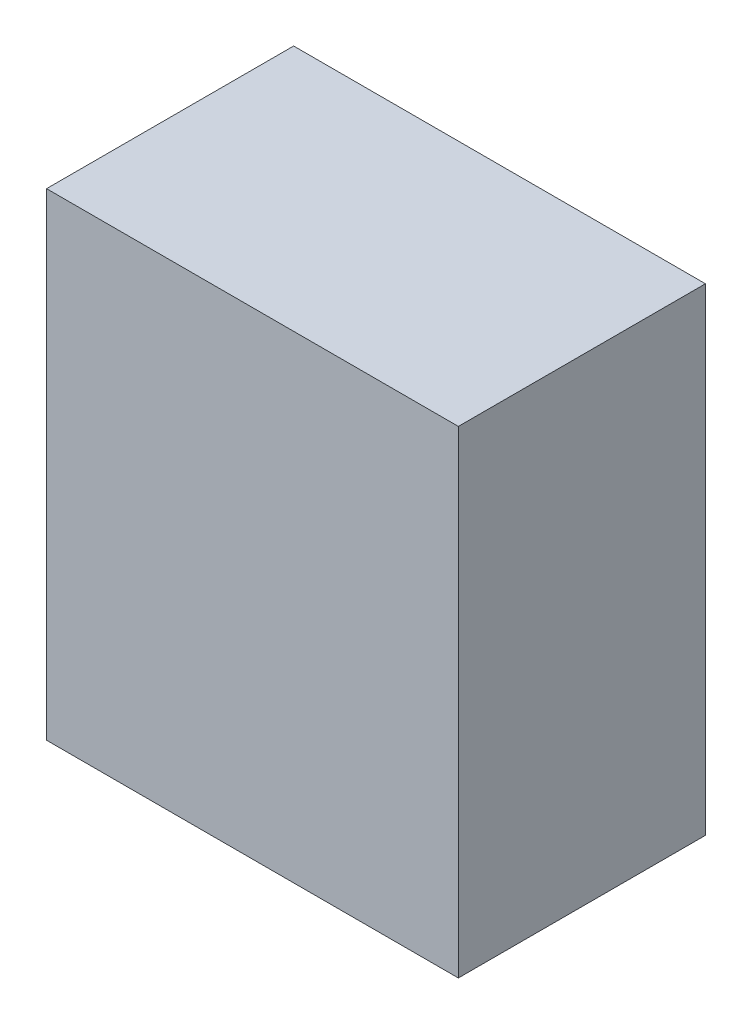
ISO-10303-21;
HEADER;
FILE_DESCRIPTION(('STEP AP214'),'2;1');
FILE_NAME('part.step','',(''),(''),'','','');
FILE_SCHEMA(('AUTOMOTIVE_DESIGN { 1 0 10303 214 1 1 1 1 }'));
ENDSEC;
DATA;
#1=APPLICATION_CONTEXT('core data for automotive mechanical design processes');
#2=APPLICATION_PROTOCOL_DEFINITION('international standard','automotive_design',2000,#1);
#3=PRODUCT_CONTEXT('',#1,'mechanical');
#4=PRODUCT('Part','Part','',(#3));
#5=PRODUCT_RELATED_PRODUCT_CATEGORY('part','',(#4));
#6=PRODUCT_DEFINITION_FORMATION('','',#4);
#7=PRODUCT_DEFINITION_CONTEXT('part definition',#1,'design');
#8=PRODUCT_DEFINITION('design','',#6,#7);
#9=PRODUCT_DEFINITION_SHAPE('','',#8);
#10=(LENGTH_UNIT() NAMED_UNIT(*) SI_UNIT(.MILLI.,.METRE.));
#11=(NAMED_UNIT(*) PLANE_ANGLE_UNIT() SI_UNIT($,.RADIAN.));
#12=(NAMED_UNIT(*) SI_UNIT($,.STERADIAN.) SOLID_ANGLE_UNIT());
#13=UNCERTAINTY_MEASURE_WITH_UNIT(LENGTH_MEASURE(1.E-05),#10,'distance_accuracy_value','');
#14=(GEOMETRIC_REPRESENTATION_CONTEXT(3) GLOBAL_UNCERTAINTY_ASSIGNED_CONTEXT((#13)) GLOBAL_UNIT_ASSIGNED_CONTEXT((#10,
#11,#12)) REPRESENTATION_CONTEXT('',''));
#15=CARTESIAN_POINT('',(0.,0.,0.));
#16=DIRECTION('',(0.,0.,1.));
#17=DIRECTION('',(1.,0.,0.));
#18=AXIS2_PLACEMENT_3D('',#15,#16,#17);
#19=CARTESIAN_POINT('',(5.,11.6,3.));
#20=DIRECTION('',(-1.,0.,0.));
#21=DIRECTION('',(0.,0.,1.));
#22=AXIS2_PLACEMENT_3D('',#19,#20,#21);
#23=PLANE('',#22);
#24=DIRECTION('',(0.,0.,-1.));
#25=VECTOR('',#24,1.);
#26=CARTESIAN_POINT('',(5.,0.,3.));
#27=LINE('',#26,#25);
#28=CARTESIAN_POINT('',(5.,0.,3.));
#29=VERTEX_POINT('',#28);
#30=CARTESIAN_POINT('',(5.,0.,-3.));
#31=VERTEX_POINT('',#30);
#32=EDGE_CURVE('E96',#29,#31,#27,.T.);
#33=ORIENTED_EDGE('',*,*,#32,.T.);
#34=DIRECTION('',(0.,-1.,0.));
#35=VECTOR('',#34,1.);
#36=CARTESIAN_POINT('',(5.,11.6,-3.));
#37=LINE('',#36,#35);
#38=CARTESIAN_POINT('',(5.,11.6,-3.));
#39=VERTEX_POINT('',#38);
#40=EDGE_CURVE('E11',#39,#31,#37,.T.);
#41=ORIENTED_EDGE('',*,*,#40,.F.);
#42=DIRECTION('',(0.,0.,-1.));
#43=VECTOR('',#42,1.);
#44=CARTESIAN_POINT('',(5.,11.6,3.));
#45=LINE('',#44,#43);
#46=CARTESIAN_POINT('',(5.,11.6,3.));
#47=VERTEX_POINT('',#46);
#48=EDGE_CURVE('E84',#47,#39,#45,.T.);
#49=ORIENTED_EDGE('',*,*,#48,.F.);
#50=DIRECTION('',(0.,-1.,0.));
#51=VECTOR('',#50,1.);
#52=CARTESIAN_POINT('',(5.,11.6,3.));
#53=LINE('',#52,#51);
#54=EDGE_CURVE('E92',#47,#29,#53,.T.);
#55=ORIENTED_EDGE('',*,*,#54,.T.);
#56=EDGE_LOOP('',(#33,#41,#49,#55));
#57=FACE_BOUND('',#56,.T.);
#58=ADVANCED_FACE('F33',(#57),#23,.F.);
#59=CARTESIAN_POINT('',(-5.,11.6,-3.));
#60=DIRECTION('',(0.,0.,1.));
#61=DIRECTION('',(1.,0.,0.));
#62=AXIS2_PLACEMENT_3D('',#59,#60,#61);
#63=PLANE('',#62);
#64=DIRECTION('',(-1.,0.,0.));
#65=VECTOR('',#64,1.);
#66=CARTESIAN_POINT('',(-5.,0.,-3.));
#67=LINE('',#66,#65);
#68=CARTESIAN_POINT('',(-5.,0.,-3.));
#69=VERTEX_POINT('',#68);
#70=EDGE_CURVE('E88',#31,#69,#67,.T.);
#71=ORIENTED_EDGE('',*,*,#70,.T.);
#72=DIRECTION('',(0.,-1.,0.));
#73=VECTOR('',#72,1.);
#74=CARTESIAN_POINT('',(-5.,11.6,-3.));
#75=LINE('',#74,#73);
#76=CARTESIAN_POINT('',(-5.,11.6,-3.));
#77=VERTEX_POINT('',#76);
#78=EDGE_CURVE('E41',#77,#69,#75,.T.);
#79=ORIENTED_EDGE('',*,*,#78,.F.);
#80=DIRECTION('',(-1.,0.,0.));
#81=VECTOR('',#80,1.);
#82=CARTESIAN_POINT('',(-5.,11.6,-3.));
#83=LINE('',#82,#81);
#84=EDGE_CURVE('E79',#39,#77,#83,.T.);
#85=ORIENTED_EDGE('',*,*,#84,.F.);
#86=ORIENTED_EDGE('',*,*,#40,.T.);
#87=EDGE_LOOP('',(#71,#79,#85,#86));
#88=FACE_BOUND('',#87,.T.);
#89=ADVANCED_FACE('F87',(#88),#63,.F.);
#90=CARTESIAN_POINT('',(-5.,11.6,3.));
#91=DIRECTION('',(1.,0.,0.));
#92=DIRECTION('',(0.,0.,-1.));
#93=AXIS2_PLACEMENT_3D('',#90,#91,#92);
#94=PLANE('',#93);
#95=DIRECTION('',(0.,0.,1.));
#96=VECTOR('',#95,1.);
#97=CARTESIAN_POINT('',(-5.,0.,3.));
#98=LINE('',#97,#96);
#99=CARTESIAN_POINT('',(-5.,0.,3.));
#100=VERTEX_POINT('',#99);
#101=EDGE_CURVE('E66',#69,#100,#98,.T.);
#102=ORIENTED_EDGE('',*,*,#101,.T.);
#103=DIRECTION('',(0.,-1.,0.));
#104=VECTOR('',#103,1.);
#105=CARTESIAN_POINT('',(-5.,11.6,3.));
#106=LINE('',#105,#104);
#107=CARTESIAN_POINT('',(-5.,11.6,3.));
#108=VERTEX_POINT('',#107);
#109=EDGE_CURVE('E89',#108,#100,#106,.T.);
#110=ORIENTED_EDGE('',*,*,#109,.F.);
#111=DIRECTION('',(0.,0.,1.));
#112=VECTOR('',#111,1.);
#113=CARTESIAN_POINT('',(-5.,11.6,3.));
#114=LINE('',#113,#112);
#115=EDGE_CURVE('E82',#77,#108,#114,.T.);
#116=ORIENTED_EDGE('',*,*,#115,.F.);
#117=ORIENTED_EDGE('',*,*,#78,.T.);
#118=EDGE_LOOP('',(#102,#110,#116,#117));
#119=FACE_BOUND('',#118,.T.);
#120=ADVANCED_FACE('F90',(#119),#94,.F.);
#121=CARTESIAN_POINT('',(-5.,11.6,3.));
#122=DIRECTION('',(0.,0.,-1.));
#123=DIRECTION('',(-1.,0.,0.));
#124=AXIS2_PLACEMENT_3D('',#121,#122,#123);
#125=PLANE('',#124);
#126=DIRECTION('',(1.,0.,0.));
#127=VECTOR('',#126,1.);
#128=CARTESIAN_POINT('',(-5.,0.,3.));
#129=LINE('',#128,#127);
#130=EDGE_CURVE('E72',#100,#29,#129,.T.);
#131=ORIENTED_EDGE('',*,*,#130,.T.);
#132=ORIENTED_EDGE('',*,*,#54,.F.);
#133=DIRECTION('',(1.,0.,0.));
#134=VECTOR('',#133,1.);
#135=CARTESIAN_POINT('',(-5.,11.6,3.));
#136=LINE('',#135,#134);
#137=EDGE_CURVE('E49',#108,#47,#136,.T.);
#138=ORIENTED_EDGE('',*,*,#137,.F.);
#139=ORIENTED_EDGE('',*,*,#109,.T.);
#140=EDGE_LOOP('',(#131,#132,#138,#139));
#141=FACE_BOUND('',#140,.T.);
#142=ADVANCED_FACE('F103',(#141),#125,.F.);
#143=CARTESIAN_POINT('',(0.,11.6,0.));
#144=DIRECTION('',(0.,-1.,0.));
#145=DIRECTION('',(0.,0.,-1.));
#146=AXIS2_PLACEMENT_3D('',#143,#144,#145);
#147=PLANE('',#146);
#148=ORIENTED_EDGE('',*,*,#48,.T.);
#149=ORIENTED_EDGE('',*,*,#84,.T.);
#150=ORIENTED_EDGE('',*,*,#115,.T.);
#151=ORIENTED_EDGE('',*,*,#137,.T.);
#152=EDGE_LOOP('',(#148,#149,#150,#151));
#153=FACE_BOUND('',#152,.T.);
#154=ADVANCED_FACE('F80',(#153),#147,.F.);
#155=CARTESIAN_POINT('',(0.,0.,0.));
#156=DIRECTION('',(0.,-1.,0.));
#157=DIRECTION('',(0.,0.,-1.));
#158=AXIS2_PLACEMENT_3D('',#155,#156,#157);
#159=PLANE('',#158);
#160=ORIENTED_EDGE('',*,*,#32,.F.);
#161=ORIENTED_EDGE('',*,*,#130,.F.);
#162=ORIENTED_EDGE('',*,*,#101,.F.);
#163=ORIENTED_EDGE('',*,*,#70,.F.);
#164=EDGE_LOOP('',(#160,#161,#162,#163));
#165=FACE_BOUND('',#164,.T.);
#166=ADVANCED_FACE('F106',(#165),#159,.T.);
#167=CLOSED_SHELL('',(#58,#89,#120,#142,#154,#166));
#168=MANIFOLD_SOLID_BREP('B2',#167);
#169=ADVANCED_BREP_SHAPE_REPRESENTATION('',(#18,#168),#14);
#170=SHAPE_DEFINITION_REPRESENTATION(#9,#169);
ENDSEC;
END-ISO-10303-21;
